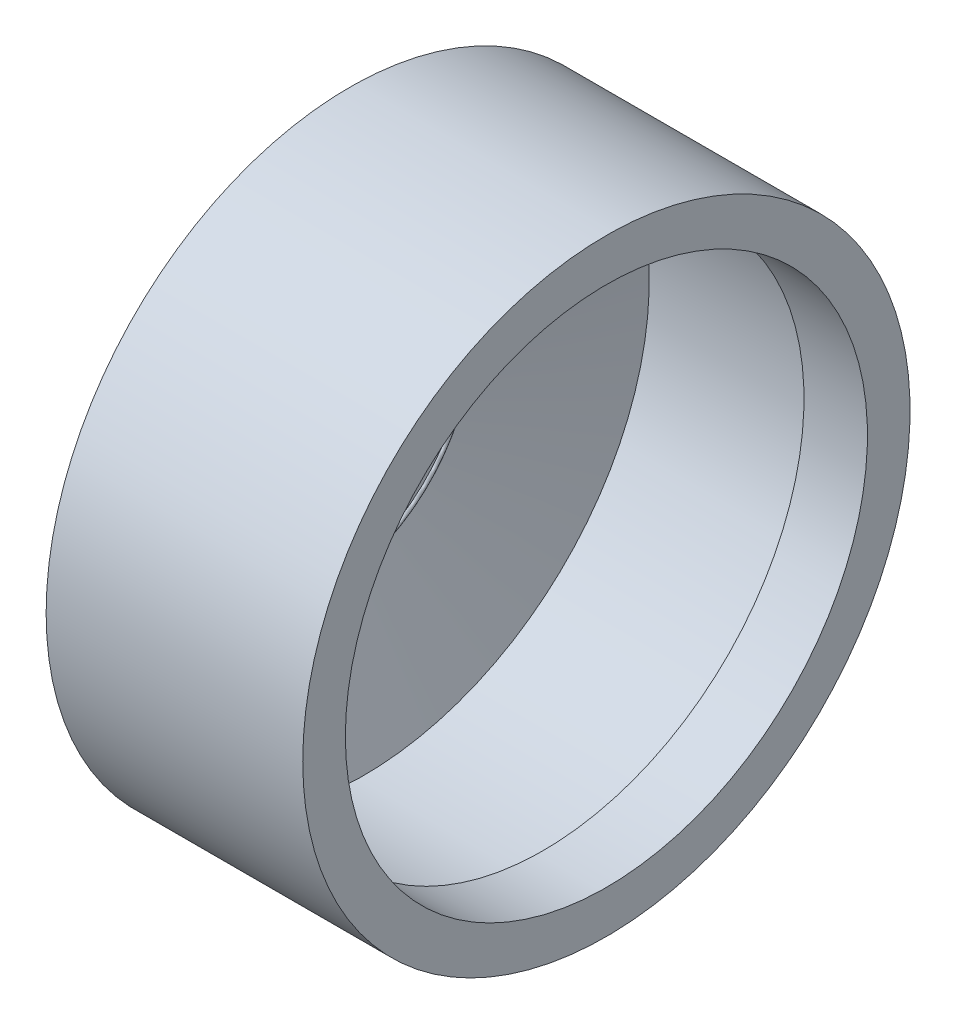
ISO-10303-21;
HEADER;
FILE_DESCRIPTION(('STEP AP214'),'2;1');
FILE_NAME('part.step','',(''),(''),'','','');
FILE_SCHEMA(('AUTOMOTIVE_DESIGN { 1 0 10303 214 1 1 1 1 }'));
ENDSEC;
DATA;
#1=APPLICATION_CONTEXT('core data for automotive mechanical design processes');
#2=APPLICATION_PROTOCOL_DEFINITION('international standard','automotive_design',2000,#1);
#3=PRODUCT_CONTEXT('',#1,'mechanical');
#4=PRODUCT('Part','Part','',(#3));
#5=PRODUCT_RELATED_PRODUCT_CATEGORY('part','',(#4));
#6=PRODUCT_DEFINITION_FORMATION('','',#4);
#7=PRODUCT_DEFINITION_CONTEXT('part definition',#1,'design');
#8=PRODUCT_DEFINITION('design','',#6,#7);
#9=PRODUCT_DEFINITION_SHAPE('','',#8);
#10=(LENGTH_UNIT() NAMED_UNIT(*) SI_UNIT(.MILLI.,.METRE.));
#11=(NAMED_UNIT(*) PLANE_ANGLE_UNIT() SI_UNIT($,.RADIAN.));
#12=(NAMED_UNIT(*) SI_UNIT($,.STERADIAN.) SOLID_ANGLE_UNIT());
#13=UNCERTAINTY_MEASURE_WITH_UNIT(LENGTH_MEASURE(1.E-05),#10,'distance_accuracy_value','');
#14=(GEOMETRIC_REPRESENTATION_CONTEXT(3) GLOBAL_UNCERTAINTY_ASSIGNED_CONTEXT((#13)) GLOBAL_UNIT_ASSIGNED_CONTEXT((#10,
#11,#12)) REPRESENTATION_CONTEXT('',''));
#15=CARTESIAN_POINT('',(0.,0.,0.));
#16=DIRECTION('',(0.,0.,1.));
#17=DIRECTION('',(1.,0.,0.));
#18=AXIS2_PLACEMENT_3D('',#15,#16,#17);
#19=CARTESIAN_POINT('',(3.11188242175129,0.,0.));
#20=DIRECTION('',(1.,0.,0.));
#21=DIRECTION('',(0.,0.,-1.));
#22=AXIS2_PLACEMENT_3D('',#19,#20,#21);
#23=CONICAL_SURFACE('',#22,15.75,1.30899693899575);
#24=CARTESIAN_POINT('',(1.03235238063782,0.,0.));
#25=DIRECTION('',(-1.,0.,0.));
#26=DIRECTION('',(0.,0.,1.));
#27=AXIS2_PLACEMENT_3D('',#24,#25,#26);
#28=CIRCLE('',#27,7.98908823069873);
#29=CARTESIAN_POINT('',(1.03235238063782,0.,7.98908823069873));
#30=VERTEX_POINT('',#29);
#31=EDGE_CURVE('E10',#30,#30,#28,.T.);
#32=ORIENTED_EDGE('',*,*,#31,.T.);
#33=EDGE_LOOP('',(#32));
#34=FACE_BOUND('',#33,.T.);
#35=CARTESIAN_POINT('',(3.11188242175129,0.,0.));
#36=DIRECTION('',(-1.,0.,0.));
#37=DIRECTION('',(0.,0.,1.));
#38=AXIS2_PLACEMENT_3D('',#35,#36,#37);
#39=CIRCLE('',#38,15.75);
#40=CARTESIAN_POINT('',(3.11188242175129,0.,15.75));
#41=VERTEX_POINT('',#40);
#42=EDGE_CURVE('E48',#41,#41,#39,.T.);
#43=ORIENTED_EDGE('',*,*,#42,.F.);
#44=EDGE_LOOP('',(#43));
#45=FACE_BOUND('',#44,.T.);
#46=ADVANCED_FACE('F41',(#34,#45),#23,.F.);
#47=CARTESIAN_POINT('',(0.,0.,0.));
#48=DIRECTION('',(-1.,0.,0.));
#49=DIRECTION('',(0.,0.,1.));
#50=AXIS2_PLACEMENT_3D('',#47,#48,#49);
#51=CYLINDRICAL_SURFACE('',#50,15.75);
#52=ORIENTED_EDGE('',*,*,#42,.T.);
#53=EDGE_LOOP('',(#52));
#54=FACE_BOUND('',#53,.T.);
#55=CARTESIAN_POINT('',(13.,0.,0.));
#56=DIRECTION('',(-1.,0.,0.));
#57=DIRECTION('',(0.,0.,1.));
#58=AXIS2_PLACEMENT_3D('',#55,#56,#57);
#59=CIRCLE('',#58,15.75);
#60=CARTESIAN_POINT('',(13.,0.,15.75));
#61=VERTEX_POINT('',#60);
#62=EDGE_CURVE('E52',#61,#61,#59,.T.);
#63=ORIENTED_EDGE('',*,*,#62,.F.);
#64=EDGE_LOOP('',(#63));
#65=FACE_BOUND('',#64,.T.);
#66=ADVANCED_FACE('F127',(#54,#65),#51,.F.);
#67=CARTESIAN_POINT('',(13.,0.,0.));
#68=DIRECTION('',(-1.,0.,0.));
#69=DIRECTION('',(0.,0.,1.));
#70=AXIS2_PLACEMENT_3D('',#67,#68,#69);
#71=PLANE('',#70);
#72=ORIENTED_EDGE('',*,*,#62,.T.);
#73=EDGE_LOOP('',(#72));
#74=FACE_BOUND('',#73,.T.);
#75=CARTESIAN_POINT('',(13.,0.,0.));
#76=DIRECTION('',(-1.,0.,0.));
#77=DIRECTION('',(0.,0.,1.));
#78=AXIS2_PLACEMENT_3D('',#75,#76,#77);
#79=CIRCLE('',#78,14.4);
#80=CARTESIAN_POINT('',(13.,0.,14.4));
#81=VERTEX_POINT('',#80);
#82=EDGE_CURVE('E56',#81,#81,#79,.T.);
#83=ORIENTED_EDGE('',*,*,#82,.F.);
#84=EDGE_LOOP('',(#83));
#85=FACE_BOUND('',#84,.T.);
#86=ADVANCED_FACE('F123',(#74,#85),#71,.T.);
#87=CARTESIAN_POINT('',(0.,0.,0.));
#88=DIRECTION('',(-1.,0.,0.));
#89=DIRECTION('',(0.,0.,1.));
#90=AXIS2_PLACEMENT_3D('',#87,#88,#89);
#91=CYLINDRICAL_SURFACE('',#90,14.4);
#92=ORIENTED_EDGE('',*,*,#82,.T.);
#93=EDGE_LOOP('',(#92));
#94=FACE_BOUND('',#93,.T.);
#95=CARTESIAN_POINT('',(16.5,0.,0.));
#96=DIRECTION('',(-1.,0.,0.));
#97=DIRECTION('',(0.,0.,1.));
#98=AXIS2_PLACEMENT_3D('',#95,#96,#97);
#99=CIRCLE('',#98,14.4);
#100=CARTESIAN_POINT('',(16.5,0.,14.4));
#101=VERTEX_POINT('',#100);
#102=EDGE_CURVE('E61',#101,#101,#99,.T.);
#103=ORIENTED_EDGE('',*,*,#102,.F.);
#104=EDGE_LOOP('',(#103));
#105=FACE_BOUND('',#104,.T.);
#106=ADVANCED_FACE('F119',(#94,#105),#91,.F.);
#107=CARTESIAN_POINT('',(16.5,0.,0.));
#108=DIRECTION('',(1.,0.,0.));
#109=DIRECTION('',(0.,0.,-1.));
#110=AXIS2_PLACEMENT_3D('',#107,#108,#109);
#111=PLANE('',#110);
#112=ORIENTED_EDGE('',*,*,#102,.T.);
#113=EDGE_LOOP('',(#112));
#114=FACE_BOUND('',#113,.T.);
#115=CARTESIAN_POINT('',(16.5,0.,0.));
#116=DIRECTION('',(-1.,0.,0.));
#117=DIRECTION('',(0.,0.,1.));
#118=AXIS2_PLACEMENT_3D('',#115,#116,#117);
#119=CIRCLE('',#118,16.75);
#120=CARTESIAN_POINT('',(16.5,0.,16.75));
#121=VERTEX_POINT('',#120);
#122=EDGE_CURVE('E64',#121,#121,#119,.T.);
#123=ORIENTED_EDGE('',*,*,#122,.F.);
#124=EDGE_LOOP('',(#123));
#125=FACE_BOUND('',#124,.T.);
#126=ADVANCED_FACE('F115',(#114,#125),#111,.T.);
#127=CARTESIAN_POINT('',(0.,0.,0.));
#128=DIRECTION('',(-1.,0.,0.));
#129=DIRECTION('',(0.,0.,1.));
#130=AXIS2_PLACEMENT_3D('',#127,#128,#129);
#131=CYLINDRICAL_SURFACE('',#130,16.75);
#132=ORIENTED_EDGE('',*,*,#122,.T.);
#133=EDGE_LOOP('',(#132));
#134=FACE_BOUND('',#133,.T.);
#135=CARTESIAN_POINT('',(2.34455543377233,0.,0.));
#136=DIRECTION('',(-1.,0.,0.));
#137=DIRECTION('',(0.,0.,1.));
#138=AXIS2_PLACEMENT_3D('',#135,#136,#137);
#139=CIRCLE('',#138,16.75);
#140=CARTESIAN_POINT('',(2.34455543377233,0.,16.75));
#141=VERTEX_POINT('',#140);
#142=EDGE_CURVE('E67',#141,#141,#139,.T.);
#143=ORIENTED_EDGE('',*,*,#142,.F.);
#144=EDGE_LOOP('',(#143));
#145=FACE_BOUND('',#144,.T.);
#146=ADVANCED_FACE('F111',(#134,#145),#131,.T.);
#147=CARTESIAN_POINT('',(0.,0.,0.));
#148=DIRECTION('',(1.,0.,0.));
#149=DIRECTION('',(0.,0.,-1.));
#150=AXIS2_PLACEMENT_3D('',#147,#148,#149);
#151=CONICAL_SURFACE('',#150,8.,1.30899693899575);
#152=ORIENTED_EDGE('',*,*,#142,.T.);
#153=EDGE_LOOP('',(#152));
#154=FACE_BOUND('',#153,.T.);
#155=CARTESIAN_POINT('',(0.,0.,0.));
#156=DIRECTION('',(-1.,0.,0.));
#157=DIRECTION('',(0.,0.,1.));
#158=AXIS2_PLACEMENT_3D('',#155,#156,#157);
#159=CIRCLE('',#158,8.);
#160=CARTESIAN_POINT('',(0.,0.,8.));
#161=VERTEX_POINT('',#160);
#162=EDGE_CURVE('E70',#161,#161,#159,.T.);
#163=ORIENTED_EDGE('',*,*,#162,.F.);
#164=EDGE_LOOP('',(#163));
#165=FACE_BOUND('',#164,.T.);
#166=ADVANCED_FACE('F107',(#154,#165),#151,.T.);
#167=CARTESIAN_POINT('',(0.,0.,0.));
#168=DIRECTION('',(-1.,0.,0.));
#169=DIRECTION('',(0.,0.,1.));
#170=AXIS2_PLACEMENT_3D('',#167,#168,#169);
#171=CYLINDRICAL_SURFACE('',#170,8.);
#172=ORIENTED_EDGE('',*,*,#162,.T.);
#173=EDGE_LOOP('',(#172));
#174=FACE_BOUND('',#173,.T.);
#175=CARTESIAN_POINT('',(0.25,0.,0.));
#176=DIRECTION('',(-1.,0.,0.));
#177=DIRECTION('',(0.,0.,1.));
#178=AXIS2_PLACEMENT_3D('',#175,#176,#177);
#179=CIRCLE('',#178,8.);
#180=CARTESIAN_POINT('',(0.25,0.,8.));
#181=VERTEX_POINT('',#180);
#182=EDGE_CURVE('E73',#181,#181,#179,.T.);
#183=ORIENTED_EDGE('',*,*,#182,.F.);
#184=EDGE_LOOP('',(#183));
#185=FACE_BOUND('',#184,.T.);
#186=ADVANCED_FACE('F103',(#174,#185),#171,.F.);
#187=CARTESIAN_POINT('',(0.25,0.,0.));
#188=DIRECTION('',(-1.,0.,0.));
#189=DIRECTION('',(0.,0.,1.));
#190=AXIS2_PLACEMENT_3D('',#187,#188,#189);
#191=PLANE('',#190);
#192=ORIENTED_EDGE('',*,*,#182,.T.);
#193=EDGE_LOOP('',(#192));
#194=FACE_BOUND('',#193,.T.);
#195=CARTESIAN_POINT('',(0.25,0.,0.));
#196=DIRECTION('',(-1.,0.,0.));
#197=DIRECTION('',(0.,0.,1.));
#198=AXIS2_PLACEMENT_3D('',#195,#196,#197);
#199=CIRCLE('',#198,3.5);
#200=CARTESIAN_POINT('',(0.25,0.,3.5));
#201=VERTEX_POINT('',#200);
#202=EDGE_CURVE('E76',#201,#201,#199,.T.);
#203=ORIENTED_EDGE('',*,*,#202,.F.);
#204=EDGE_LOOP('',(#203));
#205=FACE_BOUND('',#204,.T.);
#206=ADVANCED_FACE('F97',(#194,#205),#191,.T.);
#207=CARTESIAN_POINT('',(0.,0.,0.));
#208=DIRECTION('',(-1.,0.,0.));
#209=DIRECTION('',(0.,0.,1.));
#210=AXIS2_PLACEMENT_3D('',#207,#208,#209);
#211=CYLINDRICAL_SURFACE('',#210,3.5);
#212=ORIENTED_EDGE('',*,*,#202,.T.);
#213=EDGE_LOOP('',(#212));
#214=FACE_BOUND('',#213,.T.);
#215=CARTESIAN_POINT('',(1.,0.,0.));
#216=DIRECTION('',(-1.,0.,0.));
#217=DIRECTION('',(0.,0.,1.));
#218=AXIS2_PLACEMENT_3D('',#215,#216,#217);
#219=CIRCLE('',#218,3.5);
#220=CARTESIAN_POINT('',(1.,0.,3.5));
#221=VERTEX_POINT('',#220);
#222=EDGE_CURVE('E79',#221,#221,#219,.T.);
#223=ORIENTED_EDGE('',*,*,#222,.F.);
#224=EDGE_LOOP('',(#223));
#225=FACE_BOUND('',#224,.T.);
#226=ADVANCED_FACE('F89',(#214,#225),#211,.F.);
#227=CARTESIAN_POINT('',(1.,0.,0.));
#228=DIRECTION('',(1.,0.,0.));
#229=DIRECTION('',(0.,0.,-1.));
#230=AXIS2_PLACEMENT_3D('',#227,#228,#229);
#231=PLANE('',#230);
#232=ORIENTED_EDGE('',*,*,#222,.T.);
#233=EDGE_LOOP('',(#232));
#234=FACE_BOUND('',#233,.T.);
#235=CARTESIAN_POINT('',(1.,0.,0.));
#236=DIRECTION('',(-1.,0.,0.));
#237=DIRECTION('',(0.,0.,1.));
#238=AXIS2_PLACEMENT_3D('',#235,#236,#237);
#239=CIRCLE('',#238,7.7433475024126);
#240=CARTESIAN_POINT('',(1.,0.,7.7433475024126));
#241=VERTEX_POINT('',#240);
#242=EDGE_CURVE('E82',#241,#241,#239,.T.);
#243=ORIENTED_EDGE('',*,*,#242,.F.);
#244=EDGE_LOOP('',(#243));
#245=FACE_BOUND('',#244,.T.);
#246=ADVANCED_FACE('F87',(#234,#245),#231,.T.);
#247=CARTESIAN_POINT('',(1.,0.,0.));
#248=DIRECTION('',(-1.,0.,0.));
#249=DIRECTION('',(0.,0.,1.));
#250=AXIS2_PLACEMENT_3D('',#247,#248,#249);
#251=TOROIDAL_SURFACE('',#250,7.8683475024126,0.125);
#252=ORIENTED_EDGE('',*,*,#31,.F.);
#253=EDGE_LOOP('',(#252));
#254=FACE_BOUND('',#253,.T.);
#255=ORIENTED_EDGE('',*,*,#242,.T.);
#256=EDGE_LOOP('',(#255));
#257=FACE_BOUND('',#256,.T.);
#258=ADVANCED_FACE('F43',(#254,#257),#251,.T.);
#259=CLOSED_SHELL('',(#46,#66,#86,#106,#126,#146,#166,#186,#206,#226,#246,#258));
#260=MANIFOLD_SOLID_BREP('B2',#259);
#261=ADVANCED_BREP_SHAPE_REPRESENTATION('',(#18,#260),#14);
#262=SHAPE_DEFINITION_REPRESENTATION(#9,#261);
ENDSEC;
END-ISO-10303-21;
